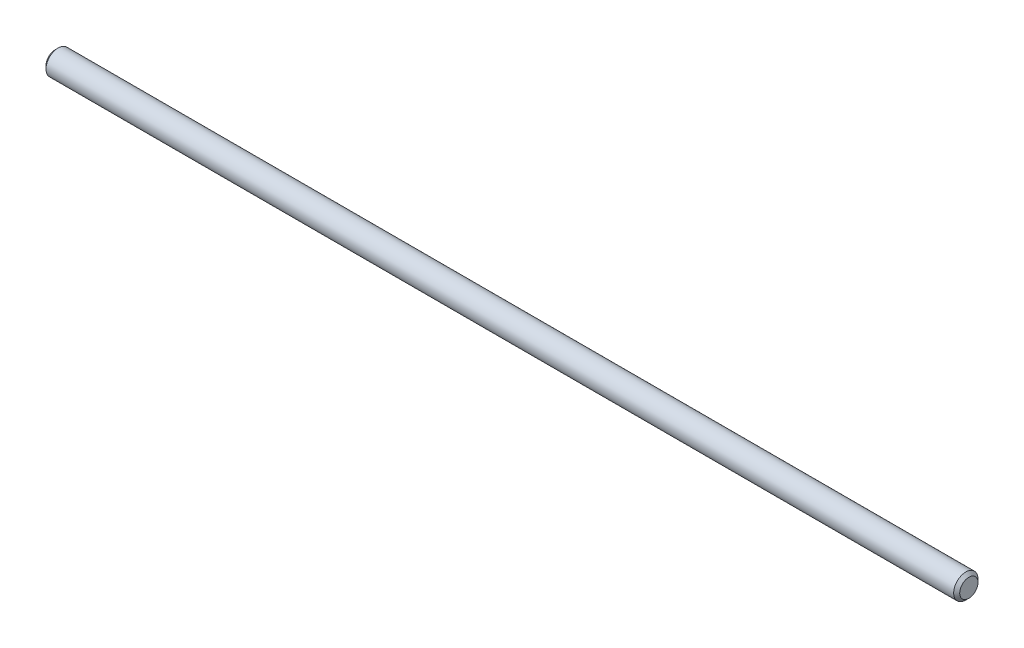
ISO-10303-21;
HEADER;
FILE_DESCRIPTION(('STEP AP214'),'2;1');
FILE_NAME('part.step','',(''),(''),'','','');
FILE_SCHEMA(('AUTOMOTIVE_DESIGN { 1 0 10303 214 1 1 1 1 }'));
ENDSEC;
DATA;
#1=APPLICATION_CONTEXT('core data for automotive mechanical design processes');
#2=APPLICATION_PROTOCOL_DEFINITION('international standard','automotive_design',2000,#1);
#3=PRODUCT_CONTEXT('',#1,'mechanical');
#4=PRODUCT('Part','Part','',(#3));
#5=PRODUCT_RELATED_PRODUCT_CATEGORY('part','',(#4));
#6=PRODUCT_DEFINITION_FORMATION('','',#4);
#7=PRODUCT_DEFINITION_CONTEXT('part definition',#1,'design');
#8=PRODUCT_DEFINITION('design','',#6,#7);
#9=PRODUCT_DEFINITION_SHAPE('','',#8);
#10=(LENGTH_UNIT() NAMED_UNIT(*) SI_UNIT(.MILLI.,.METRE.));
#11=(NAMED_UNIT(*) PLANE_ANGLE_UNIT() SI_UNIT($,.RADIAN.));
#12=(NAMED_UNIT(*) SI_UNIT($,.STERADIAN.) SOLID_ANGLE_UNIT());
#13=UNCERTAINTY_MEASURE_WITH_UNIT(LENGTH_MEASURE(1.E-05),#10,'distance_accuracy_value','');
#14=(GEOMETRIC_REPRESENTATION_CONTEXT(3) GLOBAL_UNCERTAINTY_ASSIGNED_CONTEXT((#13)) GLOBAL_UNIT_ASSIGNED_CONTEXT((#10,
#11,#12)) REPRESENTATION_CONTEXT('',''));
#15=CARTESIAN_POINT('',(0.,0.,0.));
#16=DIRECTION('',(0.,0.,1.));
#17=DIRECTION('',(1.,0.,0.));
#18=AXIS2_PLACEMENT_3D('',#15,#16,#17);
#19=CARTESIAN_POINT('',(300.,0.,0.));
#20=DIRECTION('',(-1.,0.,0.));
#21=DIRECTION('',(0.,0.,1.));
#22=AXIS2_PLACEMENT_3D('',#19,#20,#21);
#23=CYLINDRICAL_SURFACE('',#22,4.);
#24=CARTESIAN_POINT('',(1.00000000000006,0.,0.));
#25=DIRECTION('',(1.,0.,0.));
#26=DIRECTION('',(0.,0.,-1.));
#27=AXIS2_PLACEMENT_3D('',#24,#25,#26);
#28=CIRCLE('',#27,4.);
#29=CARTESIAN_POINT('',(1.00000000000006,0.,-4.));
#30=VERTEX_POINT('',#29);
#31=EDGE_CURVE('E40',#30,#30,#28,.T.);
#32=ORIENTED_EDGE('',*,*,#31,.T.);
#33=EDGE_LOOP('',(#32));
#34=FACE_BOUND('',#33,.T.);
#35=CARTESIAN_POINT('',(299.,0.,0.));
#36=DIRECTION('',(1.,0.,0.));
#37=DIRECTION('',(0.,0.,-1.));
#38=AXIS2_PLACEMENT_3D('',#35,#36,#37);
#39=CIRCLE('',#38,4.);
#40=CARTESIAN_POINT('',(299.,0.,-4.));
#41=VERTEX_POINT('',#40);
#42=EDGE_CURVE('E44',#41,#41,#39,.F.);
#43=ORIENTED_EDGE('',*,*,#42,.T.);
#44=EDGE_LOOP('',(#43));
#45=FACE_BOUND('',#44,.T.);
#46=ADVANCED_FACE('F33',(#34,#45),#23,.T.);
#47=CARTESIAN_POINT('',(300.,0.,0.));
#48=DIRECTION('',(1.,0.,0.));
#49=DIRECTION('',(0.,0.,-1.));
#50=AXIS2_PLACEMENT_3D('',#47,#48,#49);
#51=PLANE('',#50);
#52=CARTESIAN_POINT('',(300.,0.,0.));
#53=DIRECTION('',(1.,0.,0.));
#54=DIRECTION('',(0.,0.,-1.));
#55=AXIS2_PLACEMENT_3D('',#52,#53,#54);
#56=CIRCLE('',#55,2.99999999999998);
#57=CARTESIAN_POINT('',(300.,0.,-2.99999999999998));
#58=VERTEX_POINT('',#57);
#59=EDGE_CURVE('E48',#58,#58,#56,.T.);
#60=ORIENTED_EDGE('',*,*,#59,.T.);
#61=EDGE_LOOP('',(#60));
#62=FACE_BOUND('',#61,.T.);
#63=ADVANCED_FACE('F54',(#62),#51,.T.);
#64=CARTESIAN_POINT('',(0.,0.,0.));
#65=DIRECTION('',(1.,0.,0.));
#66=DIRECTION('',(0.,0.,-1.));
#67=AXIS2_PLACEMENT_3D('',#64,#65,#66);
#68=PLANE('',#67);
#69=CARTESIAN_POINT('',(0.,0.,0.));
#70=DIRECTION('',(1.,0.,0.));
#71=DIRECTION('',(0.,0.,-1.));
#72=AXIS2_PLACEMENT_3D('',#69,#70,#71);
#73=CIRCLE('',#72,2.99999999999992);
#74=CARTESIAN_POINT('',(0.,0.,-2.99999999999992));
#75=VERTEX_POINT('',#74);
#76=EDGE_CURVE('E10',#75,#75,#73,.F.);
#77=ORIENTED_EDGE('',*,*,#76,.T.);
#78=EDGE_LOOP('',(#77));
#79=FACE_BOUND('',#78,.T.);
#80=ADVANCED_FACE('F58',(#79),#68,.F.);
#81=CARTESIAN_POINT('',(300.,0.,0.));
#82=DIRECTION('',(-1.,0.,0.));
#83=DIRECTION('',(0.,0.,1.));
#84=AXIS2_PLACEMENT_3D('',#81,#82,#83);
#85=CONICAL_SURFACE('',#84,2.99999999999998,0.785398163397461);
#86=ORIENTED_EDGE('',*,*,#42,.F.);
#87=EDGE_LOOP('',(#86));
#88=FACE_BOUND('',#87,.T.);
#89=ORIENTED_EDGE('',*,*,#59,.F.);
#90=EDGE_LOOP('',(#89));
#91=FACE_BOUND('',#90,.T.);
#92=ADVANCED_FACE('F56',(#88,#91),#85,.T.);
#93=CARTESIAN_POINT('',(1.00000000000006,0.,0.));
#94=DIRECTION('',(1.,0.,0.));
#95=DIRECTION('',(0.,0.,-1.));
#96=AXIS2_PLACEMENT_3D('',#93,#94,#95);
#97=CONICAL_SURFACE('',#96,4.,0.785398163397461);
#98=ORIENTED_EDGE('',*,*,#76,.F.);
#99=EDGE_LOOP('',(#98));
#100=FACE_BOUND('',#99,.T.);
#101=ORIENTED_EDGE('',*,*,#31,.F.);
#102=EDGE_LOOP('',(#101));
#103=FACE_BOUND('',#102,.T.);
#104=ADVANCED_FACE('F35',(#100,#103),#97,.T.);
#105=CLOSED_SHELL('',(#46,#63,#80,#92,#104));
#106=MANIFOLD_SOLID_BREP('B2',#105);
#107=ADVANCED_BREP_SHAPE_REPRESENTATION('',(#18,#106),#14);
#108=SHAPE_DEFINITION_REPRESENTATION(#9,#107);
ENDSEC;
END-ISO-10303-21;
